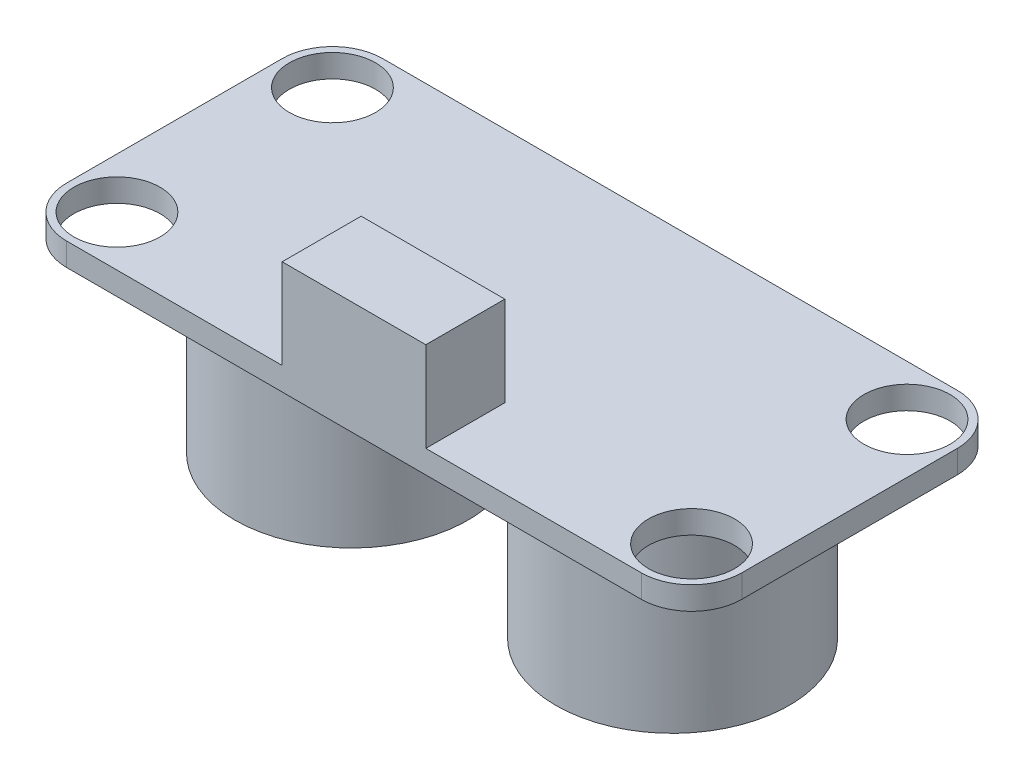
ISO-10303-21;
HEADER;
FILE_DESCRIPTION(('STEP AP214'),'2;1');
FILE_NAME('part.step','',(''),(''),'','','');
FILE_SCHEMA(('AUTOMOTIVE_DESIGN { 1 0 10303 214 1 1 1 1 }'));
ENDSEC;
DATA;
#1=APPLICATION_CONTEXT('core data for automotive mechanical design processes');
#2=APPLICATION_PROTOCOL_DEFINITION('international standard','automotive_design',2000,#1);
#3=PRODUCT_CONTEXT('',#1,'mechanical');
#4=PRODUCT('Part','Part','',(#3));
#5=PRODUCT_RELATED_PRODUCT_CATEGORY('part','',(#4));
#6=PRODUCT_DEFINITION_FORMATION('','',#4);
#7=PRODUCT_DEFINITION_CONTEXT('part definition',#1,'design');
#8=PRODUCT_DEFINITION('design','',#6,#7);
#9=PRODUCT_DEFINITION_SHAPE('','',#8);
#10=(LENGTH_UNIT() NAMED_UNIT(*) SI_UNIT(.MILLI.,.METRE.));
#11=(NAMED_UNIT(*) PLANE_ANGLE_UNIT() SI_UNIT($,.RADIAN.));
#12=(NAMED_UNIT(*) SI_UNIT($,.STERADIAN.) SOLID_ANGLE_UNIT());
#13=UNCERTAINTY_MEASURE_WITH_UNIT(LENGTH_MEASURE(1.E-05),#10,'distance_accuracy_value','');
#14=(GEOMETRIC_REPRESENTATION_CONTEXT(3) GLOBAL_UNCERTAINTY_ASSIGNED_CONTEXT((#13)) GLOBAL_UNIT_ASSIGNED_CONTEXT((#10,
#11,#12)) REPRESENTATION_CONTEXT('',''));
#15=CARTESIAN_POINT('',(0.,0.,0.));
#16=DIRECTION('',(0.,0.,1.));
#17=DIRECTION('',(1.,0.,0.));
#18=AXIS2_PLACEMENT_3D('',#15,#16,#17);
#19=CARTESIAN_POINT('',(43.5,1.6,-18.5));
#20=DIRECTION('',(0.,1.,0.));
#21=DIRECTION('',(0.,0.,1.));
#22=AXIS2_PLACEMENT_3D('',#19,#20,#21);
#23=PLANE('',#22);
#24=DIRECTION('',(0.,0.,1.));
#25=VECTOR('',#24,1.);
#26=CARTESIAN_POINT('',(18.5,1.6,-5.5));
#27=LINE('',#26,#25);
#28=CARTESIAN_POINT('',(18.5,1.6,-5.5));
#29=VERTEX_POINT('',#28);
#30=CARTESIAN_POINT('',(18.5,1.6,0.));
#31=VERTEX_POINT('',#30);
#32=EDGE_CURVE('E61',#29,#31,#27,.T.);
#33=ORIENTED_EDGE('',*,*,#32,.F.);
#34=DIRECTION('',(-1.,0.,0.));
#35=VECTOR('',#34,1.);
#36=CARTESIAN_POINT('',(28.5,1.6,-5.5));
#37=LINE('',#36,#35);
#38=CARTESIAN_POINT('',(28.5,1.6,-5.5));
#39=VERTEX_POINT('',#38);
#40=EDGE_CURVE('E156',#39,#29,#37,.T.);
#41=ORIENTED_EDGE('',*,*,#40,.F.);
#42=DIRECTION('',(0.,0.,-1.));
#43=VECTOR('',#42,1.);
#44=CARTESIAN_POINT('',(28.5,1.6,0.));
#45=LINE('',#44,#43);
#46=CARTESIAN_POINT('',(28.5,1.6,0.));
#47=VERTEX_POINT('',#46);
#48=EDGE_CURVE('E67',#47,#39,#45,.T.);
#49=ORIENTED_EDGE('',*,*,#48,.F.);
#50=DIRECTION('',(1.,0.,0.));
#51=VECTOR('',#50,1.);
#52=CARTESIAN_POINT('',(3.50000000000002,1.6,0.));
#53=LINE('',#52,#51);
#54=CARTESIAN_POINT('',(43.5,1.6,0.));
#55=VERTEX_POINT('',#54);
#56=EDGE_CURVE('E216',#47,#55,#53,.T.);
#57=ORIENTED_EDGE('',*,*,#56,.T.);
#58=CARTESIAN_POINT('',(43.5,1.6,-3.5));
#59=DIRECTION('',(0.,1.,0.));
#60=DIRECTION('',(0.,0.,1.));
#61=AXIS2_PLACEMENT_3D('',#58,#59,#60);
#62=CIRCLE('',#61,3.5);
#63=CARTESIAN_POINT('',(47.,1.6,-3.5));
#64=VERTEX_POINT('',#63);
#65=EDGE_CURVE('E220',#55,#64,#62,.T.);
#66=ORIENTED_EDGE('',*,*,#65,.T.);
#67=DIRECTION('',(0.,0.,-1.));
#68=VECTOR('',#67,1.);
#69=CARTESIAN_POINT('',(47.,1.6,-3.5));
#70=LINE('',#69,#68);
#71=CARTESIAN_POINT('',(47.,1.6,-18.5));
#72=VERTEX_POINT('',#71);
#73=EDGE_CURVE('E223',#64,#72,#70,.T.);
#74=ORIENTED_EDGE('',*,*,#73,.T.);
#75=CARTESIAN_POINT('',(43.5,1.6,-18.5));
#76=DIRECTION('',(0.,1.,0.));
#77=DIRECTION('',(0.,0.,1.));
#78=AXIS2_PLACEMENT_3D('',#75,#76,#77);
#79=CIRCLE('',#78,3.5);
#80=CARTESIAN_POINT('',(43.5,1.6,-22.));
#81=VERTEX_POINT('',#80);
#82=EDGE_CURVE('E199',#72,#81,#79,.T.);
#83=ORIENTED_EDGE('',*,*,#82,.T.);
#84=DIRECTION('',(-1.,0.,0.));
#85=VECTOR('',#84,1.);
#86=CARTESIAN_POINT('',(43.5,1.6,-22.));
#87=LINE('',#86,#85);
#88=CARTESIAN_POINT('',(3.5,1.6,-22.));
#89=VERTEX_POINT('',#88);
#90=EDGE_CURVE('E203',#81,#89,#87,.T.);
#91=ORIENTED_EDGE('',*,*,#90,.T.);
#92=CARTESIAN_POINT('',(3.5,1.6,-18.5));
#93=DIRECTION('',(0.,1.,0.));
#94=DIRECTION('',(0.,0.,1.));
#95=AXIS2_PLACEMENT_3D('',#92,#93,#94);
#96=CIRCLE('',#95,3.5);
#97=CARTESIAN_POINT('',(0.,1.6,-18.5));
#98=VERTEX_POINT('',#97);
#99=EDGE_CURVE('E207',#89,#98,#96,.T.);
#100=ORIENTED_EDGE('',*,*,#99,.T.);
#101=DIRECTION('',(0.,0.,1.));
#102=VECTOR('',#101,1.);
#103=CARTESIAN_POINT('',(0.,1.6,-18.5));
#104=LINE('',#103,#102);
#105=CARTESIAN_POINT('',(0.,1.6,-3.50000000000002));
#106=VERTEX_POINT('',#105);
#107=EDGE_CURVE('E210',#98,#106,#104,.T.);
#108=ORIENTED_EDGE('',*,*,#107,.T.);
#109=CARTESIAN_POINT('',(3.5,1.6,-3.5));
#110=DIRECTION('',(0.,1.,0.));
#111=DIRECTION('',(0.,0.,-1.));
#112=AXIS2_PLACEMENT_3D('',#109,#110,#111);
#113=CIRCLE('',#112,3.5);
#114=CARTESIAN_POINT('',(3.50000000000002,1.6,0.));
#115=VERTEX_POINT('',#114);
#116=EDGE_CURVE('E213',#106,#115,#113,.T.);
#117=ORIENTED_EDGE('',*,*,#116,.T.);
#118=EDGE_CURVE('E217',#115,#31,#53,.T.);
#119=ORIENTED_EDGE('',*,*,#118,.T.);
#120=EDGE_LOOP('',(#33,#41,#49,#57,#66,#74,#83,#91,#100,#108,#117,#119));
#121=FACE_BOUND('',#120,.T.);
#122=CARTESIAN_POINT('',(43.5,1.6,-3.5));
#123=DIRECTION('',(0.,1.,0.));
#124=DIRECTION('',(0.,0.,1.));
#125=AXIS2_PLACEMENT_3D('',#122,#123,#124);
#126=CIRCLE('',#125,3.00000000000001);
#127=CARTESIAN_POINT('',(43.5,1.6,-0.499999999999992));
#128=VERTEX_POINT('',#127);
#129=EDGE_CURVE('E175',#128,#128,#126,.T.);
#130=ORIENTED_EDGE('',*,*,#129,.F.);
#131=EDGE_LOOP('',(#130));
#132=FACE_BOUND('',#131,.T.);
#133=CARTESIAN_POINT('',(3.5,1.6,-18.5));
#134=DIRECTION('',(0.,1.,0.));
#135=DIRECTION('',(0.,0.,1.));
#136=AXIS2_PLACEMENT_3D('',#133,#134,#135);
#137=CIRCLE('',#136,3.);
#138=CARTESIAN_POINT('',(3.5,1.6,-15.5));
#139=VERTEX_POINT('',#138);
#140=EDGE_CURVE('E191',#139,#139,#137,.T.);
#141=ORIENTED_EDGE('',*,*,#140,.F.);
#142=EDGE_LOOP('',(#141));
#143=FACE_BOUND('',#142,.T.);
#144=CARTESIAN_POINT('',(3.5,1.6,-3.5));
#145=DIRECTION('',(0.,1.,0.));
#146=DIRECTION('',(0.,0.,1.));
#147=AXIS2_PLACEMENT_3D('',#144,#145,#146);
#148=CIRCLE('',#147,3.);
#149=CARTESIAN_POINT('',(3.5,1.6,-0.5));
#150=VERTEX_POINT('',#149);
#151=EDGE_CURVE('E183',#150,#150,#148,.T.);
#152=ORIENTED_EDGE('',*,*,#151,.F.);
#153=EDGE_LOOP('',(#152));
#154=FACE_BOUND('',#153,.T.);
#155=CARTESIAN_POINT('',(43.5,1.6,-18.5));
#156=DIRECTION('',(0.,1.,0.));
#157=DIRECTION('',(0.,0.,1.));
#158=AXIS2_PLACEMENT_3D('',#155,#156,#157);
#159=CIRCLE('',#158,3.00000000000001);
#160=CARTESIAN_POINT('',(43.5,1.6,-15.5));
#161=VERTEX_POINT('',#160);
#162=EDGE_CURVE('E165',#161,#161,#159,.T.);
#163=ORIENTED_EDGE('',*,*,#162,.F.);
#164=EDGE_LOOP('',(#163));
#165=FACE_BOUND('',#164,.T.);
#166=ADVANCED_FACE('F45',(#121,#132,#143,#154,#165),#23,.T.);
#167=CARTESIAN_POINT('',(43.5,0.,-18.5));
#168=DIRECTION('',(0.,1.,0.));
#169=DIRECTION('',(0.,0.,1.));
#170=AXIS2_PLACEMENT_3D('',#167,#168,#169);
#171=PLANE('',#170);
#172=CARTESIAN_POINT('',(34.675,0.,-11.));
#173=DIRECTION('',(0.,1.,0.));
#174=DIRECTION('',(0.,0.,1.));
#175=AXIS2_PLACEMENT_3D('',#172,#173,#174);
#176=CIRCLE('',#175,8.125);
#177=CARTESIAN_POINT('',(34.675,0.,-2.875));
#178=VERTEX_POINT('',#177);
#179=EDGE_CURVE('E11',#178,#178,#176,.F.);
#180=ORIENTED_EDGE('',*,*,#179,.F.);
#181=EDGE_LOOP('',(#180));
#182=FACE_BOUND('',#181,.T.);
#183=CARTESIAN_POINT('',(12.325,0.,-11.));
#184=DIRECTION('',(0.,1.,0.));
#185=DIRECTION('',(0.,0.,1.));
#186=AXIS2_PLACEMENT_3D('',#183,#184,#185);
#187=CIRCLE('',#186,8.125);
#188=CARTESIAN_POINT('',(12.325,0.,-2.875));
#189=VERTEX_POINT('',#188);
#190=EDGE_CURVE('E54',#189,#189,#187,.F.);
#191=ORIENTED_EDGE('',*,*,#190,.F.);
#192=EDGE_LOOP('',(#191));
#193=FACE_BOUND('',#192,.T.);
#194=CARTESIAN_POINT('',(43.5,0.,-18.5));
#195=DIRECTION('',(0.,1.,0.));
#196=DIRECTION('',(0.,0.,1.));
#197=AXIS2_PLACEMENT_3D('',#194,#195,#196);
#198=CIRCLE('',#197,3.5);
#199=CARTESIAN_POINT('',(47.,0.,-18.5));
#200=VERTEX_POINT('',#199);
#201=CARTESIAN_POINT('',(43.5,0.,-22.));
#202=VERTEX_POINT('',#201);
#203=EDGE_CURVE('E195',#200,#202,#198,.T.);
#204=ORIENTED_EDGE('',*,*,#203,.F.);
#205=DIRECTION('',(0.,0.,-1.));
#206=VECTOR('',#205,1.);
#207=CARTESIAN_POINT('',(47.,0.,-3.5));
#208=LINE('',#207,#206);
#209=CARTESIAN_POINT('',(47.,0.,-3.5));
#210=VERTEX_POINT('',#209);
#211=EDGE_CURVE('E204',#210,#200,#208,.T.);
#212=ORIENTED_EDGE('',*,*,#211,.F.);
#213=CARTESIAN_POINT('',(43.5,0.,-3.5));
#214=DIRECTION('',(0.,1.,0.));
#215=DIRECTION('',(0.,0.,1.));
#216=AXIS2_PLACEMENT_3D('',#213,#214,#215);
#217=CIRCLE('',#216,3.5);
#218=CARTESIAN_POINT('',(43.5,0.,0.));
#219=VERTEX_POINT('',#218);
#220=EDGE_CURVE('E245',#219,#210,#217,.T.);
#221=ORIENTED_EDGE('',*,*,#220,.F.);
#222=DIRECTION('',(1.,0.,0.));
#223=VECTOR('',#222,1.);
#224=CARTESIAN_POINT('',(3.50000000000002,0.,0.));
#225=LINE('',#224,#223);
#226=CARTESIAN_POINT('',(3.50000000000002,0.,0.));
#227=VERTEX_POINT('',#226);
#228=EDGE_CURVE('E242',#227,#219,#225,.T.);
#229=ORIENTED_EDGE('',*,*,#228,.F.);
#230=CARTESIAN_POINT('',(3.5,0.,-3.5));
#231=DIRECTION('',(0.,1.,0.));
#232=DIRECTION('',(0.,0.,-1.));
#233=AXIS2_PLACEMENT_3D('',#230,#231,#232);
#234=CIRCLE('',#233,3.5);
#235=CARTESIAN_POINT('',(0.,0.,-3.50000000000002));
#236=VERTEX_POINT('',#235);
#237=EDGE_CURVE('E239',#236,#227,#234,.T.);
#238=ORIENTED_EDGE('',*,*,#237,.F.);
#239=DIRECTION('',(0.,0.,1.));
#240=VECTOR('',#239,1.);
#241=CARTESIAN_POINT('',(0.,0.,-18.5));
#242=LINE('',#241,#240);
#243=CARTESIAN_POINT('',(0.,0.,-18.5));
#244=VERTEX_POINT('',#243);
#245=EDGE_CURVE('E236',#244,#236,#242,.T.);
#246=ORIENTED_EDGE('',*,*,#245,.F.);
#247=CARTESIAN_POINT('',(3.5,0.,-18.5));
#248=DIRECTION('',(0.,1.,0.));
#249=DIRECTION('',(0.,0.,1.));
#250=AXIS2_PLACEMENT_3D('',#247,#248,#249);
#251=CIRCLE('',#250,3.5);
#252=CARTESIAN_POINT('',(3.5,0.,-22.));
#253=VERTEX_POINT('',#252);
#254=EDGE_CURVE('E233',#253,#244,#251,.T.);
#255=ORIENTED_EDGE('',*,*,#254,.F.);
#256=DIRECTION('',(-1.,0.,0.));
#257=VECTOR('',#256,1.);
#258=CARTESIAN_POINT('',(43.5,0.,-22.));
#259=LINE('',#258,#257);
#260=EDGE_CURVE('E230',#202,#253,#259,.T.);
#261=ORIENTED_EDGE('',*,*,#260,.F.);
#262=EDGE_LOOP('',(#204,#212,#221,#229,#238,#246,#255,#261));
#263=FACE_BOUND('',#262,.T.);
#264=CARTESIAN_POINT('',(3.5,0.,-18.5));
#265=DIRECTION('',(0.,1.,0.));
#266=DIRECTION('',(0.,0.,1.));
#267=AXIS2_PLACEMENT_3D('',#264,#265,#266);
#268=CIRCLE('',#267,3.);
#269=CARTESIAN_POINT('',(3.5,0.,-15.5));
#270=VERTEX_POINT('',#269);
#271=EDGE_CURVE('E187',#270,#270,#268,.T.);
#272=ORIENTED_EDGE('',*,*,#271,.T.);
#273=EDGE_LOOP('',(#272));
#274=FACE_BOUND('',#273,.T.);
#275=CARTESIAN_POINT('',(3.5,0.,-3.5));
#276=DIRECTION('',(0.,1.,0.));
#277=DIRECTION('',(0.,0.,1.));
#278=AXIS2_PLACEMENT_3D('',#275,#276,#277);
#279=CIRCLE('',#278,3.);
#280=CARTESIAN_POINT('',(3.5,0.,-0.5));
#281=VERTEX_POINT('',#280);
#282=EDGE_CURVE('E179',#281,#281,#279,.T.);
#283=ORIENTED_EDGE('',*,*,#282,.T.);
#284=EDGE_LOOP('',(#283));
#285=FACE_BOUND('',#284,.T.);
#286=CARTESIAN_POINT('',(43.5,0.,-3.5));
#287=DIRECTION('',(0.,1.,0.));
#288=DIRECTION('',(0.,0.,1.));
#289=AXIS2_PLACEMENT_3D('',#286,#287,#288);
#290=CIRCLE('',#289,3.00000000000001);
#291=CARTESIAN_POINT('',(43.5,0.,-0.499999999999992));
#292=VERTEX_POINT('',#291);
#293=EDGE_CURVE('E173',#292,#292,#290,.T.);
#294=ORIENTED_EDGE('',*,*,#293,.T.);
#295=EDGE_LOOP('',(#294));
#296=FACE_BOUND('',#295,.T.);
#297=CARTESIAN_POINT('',(43.5,0.,-18.5));
#298=DIRECTION('',(0.,1.,0.));
#299=DIRECTION('',(0.,0.,1.));
#300=AXIS2_PLACEMENT_3D('',#297,#298,#299);
#301=CIRCLE('',#300,3.00000000000001);
#302=CARTESIAN_POINT('',(43.5,0.,-15.5));
#303=VERTEX_POINT('',#302);
#304=EDGE_CURVE('E160',#303,#303,#301,.T.);
#305=ORIENTED_EDGE('',*,*,#304,.T.);
#306=EDGE_LOOP('',(#305));
#307=FACE_BOUND('',#306,.T.);
#308=ADVANCED_FACE('F286',(#182,#193,#263,#274,#285,#296,#307),#171,.F.);
#309=CARTESIAN_POINT('',(43.5,1.6,-18.5));
#310=DIRECTION('',(0.,-1.,0.));
#311=DIRECTION('',(0.,0.,-1.));
#312=AXIS2_PLACEMENT_3D('',#309,#310,#311);
#313=CYLINDRICAL_SURFACE('',#312,3.5);
#314=ORIENTED_EDGE('',*,*,#203,.T.);
#315=DIRECTION('',(0.,-1.,0.));
#316=VECTOR('',#315,1.);
#317=CARTESIAN_POINT('',(43.5,1.6,-22.));
#318=LINE('',#317,#316);
#319=EDGE_CURVE('E277',#81,#202,#318,.T.);
#320=ORIENTED_EDGE('',*,*,#319,.F.);
#321=ORIENTED_EDGE('',*,*,#82,.F.);
#322=DIRECTION('',(0.,-1.,0.));
#323=VECTOR('',#322,1.);
#324=CARTESIAN_POINT('',(47.,1.6,-18.5));
#325=LINE('',#324,#323);
#326=EDGE_CURVE('E226',#72,#200,#325,.T.);
#327=ORIENTED_EDGE('',*,*,#326,.T.);
#328=EDGE_LOOP('',(#314,#320,#321,#327));
#329=FACE_BOUND('',#328,.T.);
#330=ADVANCED_FACE('F47',(#329),#313,.T.);
#331=CARTESIAN_POINT('',(43.5,1.6,-22.));
#332=DIRECTION('',(0.,0.,1.));
#333=DIRECTION('',(1.,0.,0.));
#334=AXIS2_PLACEMENT_3D('',#331,#332,#333);
#335=PLANE('',#334);
#336=ORIENTED_EDGE('',*,*,#260,.T.);
#337=DIRECTION('',(0.,-1.,0.));
#338=VECTOR('',#337,1.);
#339=CARTESIAN_POINT('',(3.5,1.6,-22.));
#340=LINE('',#339,#338);
#341=EDGE_CURVE('E273',#89,#253,#340,.T.);
#342=ORIENTED_EDGE('',*,*,#341,.F.);
#343=ORIENTED_EDGE('',*,*,#90,.F.);
#344=ORIENTED_EDGE('',*,*,#319,.T.);
#345=EDGE_LOOP('',(#336,#342,#343,#344));
#346=FACE_BOUND('',#345,.T.);
#347=ADVANCED_FACE('F345',(#346),#335,.F.);
#348=CARTESIAN_POINT('',(3.5,1.6,-18.5));
#349=DIRECTION('',(0.,-1.,0.));
#350=DIRECTION('',(0.,0.,-1.));
#351=AXIS2_PLACEMENT_3D('',#348,#349,#350);
#352=CYLINDRICAL_SURFACE('',#351,3.5);
#353=ORIENTED_EDGE('',*,*,#254,.T.);
#354=DIRECTION('',(0.,-1.,0.));
#355=VECTOR('',#354,1.);
#356=CARTESIAN_POINT('',(0.,1.6,-18.5));
#357=LINE('',#356,#355);
#358=EDGE_CURVE('E269',#98,#244,#357,.T.);
#359=ORIENTED_EDGE('',*,*,#358,.F.);
#360=ORIENTED_EDGE('',*,*,#99,.F.);
#361=ORIENTED_EDGE('',*,*,#341,.T.);
#362=EDGE_LOOP('',(#353,#359,#360,#361));
#363=FACE_BOUND('',#362,.T.);
#364=ADVANCED_FACE('F342',(#363),#352,.T.);
#365=CARTESIAN_POINT('',(0.,1.6,-18.5));
#366=DIRECTION('',(1.,0.,0.));
#367=DIRECTION('',(0.,0.,-1.));
#368=AXIS2_PLACEMENT_3D('',#365,#366,#367);
#369=PLANE('',#368);
#370=ORIENTED_EDGE('',*,*,#245,.T.);
#371=DIRECTION('',(0.,-1.,0.));
#372=VECTOR('',#371,1.);
#373=CARTESIAN_POINT('',(0.,1.6,-3.50000000000002));
#374=LINE('',#373,#372);
#375=EDGE_CURVE('E265',#106,#236,#374,.T.);
#376=ORIENTED_EDGE('',*,*,#375,.F.);
#377=ORIENTED_EDGE('',*,*,#107,.F.);
#378=ORIENTED_EDGE('',*,*,#358,.T.);
#379=EDGE_LOOP('',(#370,#376,#377,#378));
#380=FACE_BOUND('',#379,.T.);
#381=ADVANCED_FACE('F338',(#380),#369,.F.);
#382=CARTESIAN_POINT('',(3.5,1.6,-3.5));
#383=DIRECTION('',(0.,-1.,0.));
#384=DIRECTION('',(0.,0.,-1.));
#385=AXIS2_PLACEMENT_3D('',#382,#383,#384);
#386=CYLINDRICAL_SURFACE('',#385,3.5);
#387=ORIENTED_EDGE('',*,*,#237,.T.);
#388=DIRECTION('',(0.,-1.,0.));
#389=VECTOR('',#388,1.);
#390=CARTESIAN_POINT('',(3.50000000000002,1.6,0.));
#391=LINE('',#390,#389);
#392=EDGE_CURVE('E261',#115,#227,#391,.T.);
#393=ORIENTED_EDGE('',*,*,#392,.F.);
#394=ORIENTED_EDGE('',*,*,#116,.F.);
#395=ORIENTED_EDGE('',*,*,#375,.T.);
#396=EDGE_LOOP('',(#387,#393,#394,#395));
#397=FACE_BOUND('',#396,.T.);
#398=ADVANCED_FACE('F335',(#397),#386,.T.);
#399=CARTESIAN_POINT('',(3.50000000000002,1.6,0.));
#400=DIRECTION('',(0.,0.,-1.));
#401=DIRECTION('',(-1.,0.,0.));
#402=AXIS2_PLACEMENT_3D('',#399,#400,#401);
#403=PLANE('',#402);
#404=ORIENTED_EDGE('',*,*,#228,.T.);
#405=DIRECTION('',(0.,-1.,0.));
#406=VECTOR('',#405,1.);
#407=CARTESIAN_POINT('',(43.5,1.6,0.));
#408=LINE('',#407,#406);
#409=EDGE_CURVE('E257',#55,#219,#408,.T.);
#410=ORIENTED_EDGE('',*,*,#409,.F.);
#411=ORIENTED_EDGE('',*,*,#56,.F.);
#412=DIRECTION('',(0.,-1.,0.));
#413=VECTOR('',#412,1.);
#414=CARTESIAN_POINT('',(28.5,7.85,0.));
#415=LINE('',#414,#413);
#416=CARTESIAN_POINT('',(28.5,7.85,0.));
#417=VERTEX_POINT('',#416);
#418=EDGE_CURVE('E141',#417,#47,#415,.T.);
#419=ORIENTED_EDGE('',*,*,#418,.F.);
#420=DIRECTION('',(1.,0.,0.));
#421=VECTOR('',#420,1.);
#422=CARTESIAN_POINT('',(18.5,7.85,0.));
#423=LINE('',#422,#421);
#424=CARTESIAN_POINT('',(18.5,7.85,0.));
#425=VERTEX_POINT('',#424);
#426=EDGE_CURVE('E134',#425,#417,#423,.T.);
#427=ORIENTED_EDGE('',*,*,#426,.F.);
#428=DIRECTION('',(0.,-1.,0.));
#429=VECTOR('',#428,1.);
#430=CARTESIAN_POINT('',(18.5,7.85,0.));
#431=LINE('',#430,#429);
#432=EDGE_CURVE('E139',#425,#31,#431,.T.);
#433=ORIENTED_EDGE('',*,*,#432,.T.);
#434=ORIENTED_EDGE('',*,*,#118,.F.);
#435=ORIENTED_EDGE('',*,*,#392,.T.);
#436=EDGE_LOOP('',(#404,#410,#411,#419,#427,#433,#434,#435));
#437=FACE_BOUND('',#436,.T.);
#438=ADVANCED_FACE('F136',(#437),#403,.F.);
#439=CARTESIAN_POINT('',(43.5,1.6,-3.5));
#440=DIRECTION('',(0.,-1.,0.));
#441=DIRECTION('',(0.,0.,-1.));
#442=AXIS2_PLACEMENT_3D('',#439,#440,#441);
#443=CYLINDRICAL_SURFACE('',#442,3.5);
#444=ORIENTED_EDGE('',*,*,#220,.T.);
#445=DIRECTION('',(0.,-1.,0.));
#446=VECTOR('',#445,1.);
#447=CARTESIAN_POINT('',(47.,1.6,-3.5));
#448=LINE('',#447,#446);
#449=EDGE_CURVE('E253',#64,#210,#448,.T.);
#450=ORIENTED_EDGE('',*,*,#449,.F.);
#451=ORIENTED_EDGE('',*,*,#65,.F.);
#452=ORIENTED_EDGE('',*,*,#409,.T.);
#453=EDGE_LOOP('',(#444,#450,#451,#452));
#454=FACE_BOUND('',#453,.T.);
#455=ADVANCED_FACE('F328',(#454),#443,.T.);
#456=CARTESIAN_POINT('',(47.,1.6,-3.5));
#457=DIRECTION('',(-1.,0.,0.));
#458=DIRECTION('',(0.,0.,1.));
#459=AXIS2_PLACEMENT_3D('',#456,#457,#458);
#460=PLANE('',#459);
#461=ORIENTED_EDGE('',*,*,#211,.T.);
#462=ORIENTED_EDGE('',*,*,#326,.F.);
#463=ORIENTED_EDGE('',*,*,#73,.F.);
#464=ORIENTED_EDGE('',*,*,#449,.T.);
#465=EDGE_LOOP('',(#461,#462,#463,#464));
#466=FACE_BOUND('',#465,.T.);
#467=ADVANCED_FACE('F325',(#466),#460,.F.);
#468=CARTESIAN_POINT('',(3.5,1.6,-18.5));
#469=DIRECTION('',(0.,-1.,0.));
#470=DIRECTION('',(0.,0.,-1.));
#471=AXIS2_PLACEMENT_3D('',#468,#469,#470);
#472=CYLINDRICAL_SURFACE('',#471,3.);
#473=ORIENTED_EDGE('',*,*,#140,.T.);
#474=EDGE_LOOP('',(#473));
#475=FACE_BOUND('',#474,.T.);
#476=ORIENTED_EDGE('',*,*,#271,.F.);
#477=EDGE_LOOP('',(#476));
#478=FACE_BOUND('',#477,.T.);
#479=ADVANCED_FACE('F322',(#475,#478),#472,.F.);
#480=CARTESIAN_POINT('',(3.5,1.6,-3.5));
#481=DIRECTION('',(0.,-1.,0.));
#482=DIRECTION('',(0.,0.,-1.));
#483=AXIS2_PLACEMENT_3D('',#480,#481,#482);
#484=CYLINDRICAL_SURFACE('',#483,3.);
#485=ORIENTED_EDGE('',*,*,#151,.T.);
#486=EDGE_LOOP('',(#485));
#487=FACE_BOUND('',#486,.T.);
#488=ORIENTED_EDGE('',*,*,#282,.F.);
#489=EDGE_LOOP('',(#488));
#490=FACE_BOUND('',#489,.T.);
#491=ADVANCED_FACE('F313',(#487,#490),#484,.F.);
#492=CARTESIAN_POINT('',(43.5,1.6,-3.5));
#493=DIRECTION('',(0.,-1.,0.));
#494=DIRECTION('',(0.,0.,-1.));
#495=AXIS2_PLACEMENT_3D('',#492,#493,#494);
#496=CYLINDRICAL_SURFACE('',#495,3.00000000000001);
#497=ORIENTED_EDGE('',*,*,#129,.T.);
#498=EDGE_LOOP('',(#497));
#499=FACE_BOUND('',#498,.T.);
#500=ORIENTED_EDGE('',*,*,#293,.F.);
#501=EDGE_LOOP('',(#500));
#502=FACE_BOUND('',#501,.T.);
#503=ADVANCED_FACE('F304',(#499,#502),#496,.F.);
#504=CARTESIAN_POINT('',(43.5,1.6,-18.5));
#505=DIRECTION('',(0.,-1.,0.));
#506=DIRECTION('',(0.,0.,-1.));
#507=AXIS2_PLACEMENT_3D('',#504,#505,#506);
#508=CYLINDRICAL_SURFACE('',#507,3.00000000000001);
#509=ORIENTED_EDGE('',*,*,#162,.T.);
#510=EDGE_LOOP('',(#509));
#511=FACE_BOUND('',#510,.T.);
#512=ORIENTED_EDGE('',*,*,#304,.F.);
#513=EDGE_LOOP('',(#512));
#514=FACE_BOUND('',#513,.T.);
#515=ADVANCED_FACE('F302',(#511,#514),#508,.F.);
#516=CARTESIAN_POINT('',(18.5,7.85,-5.5));
#517=DIRECTION('',(1.,0.,0.));
#518=DIRECTION('',(0.,0.,-1.));
#519=AXIS2_PLACEMENT_3D('',#516,#517,#518);
#520=PLANE('',#519);
#521=ORIENTED_EDGE('',*,*,#32,.T.);
#522=ORIENTED_EDGE('',*,*,#432,.F.);
#523=DIRECTION('',(0.,0.,1.));
#524=VECTOR('',#523,1.);
#525=CARTESIAN_POINT('',(18.5,7.85,-5.5));
#526=LINE('',#525,#524);
#527=CARTESIAN_POINT('',(18.5,7.85,-5.5));
#528=VERTEX_POINT('',#527);
#529=EDGE_CURVE('E146',#528,#425,#526,.T.);
#530=ORIENTED_EDGE('',*,*,#529,.F.);
#531=DIRECTION('',(0.,-1.,0.));
#532=VECTOR('',#531,1.);
#533=CARTESIAN_POINT('',(18.5,7.85,-5.5));
#534=LINE('',#533,#532);
#535=EDGE_CURVE('E379',#528,#29,#534,.T.);
#536=ORIENTED_EDGE('',*,*,#535,.T.);
#537=EDGE_LOOP('',(#521,#522,#530,#536));
#538=FACE_BOUND('',#537,.T.);
#539=ADVANCED_FACE('F158',(#538),#520,.F.);
#540=CARTESIAN_POINT('',(28.5,7.85,0.));
#541=DIRECTION('',(-1.,0.,0.));
#542=DIRECTION('',(0.,0.,1.));
#543=AXIS2_PLACEMENT_3D('',#540,#541,#542);
#544=PLANE('',#543);
#545=ORIENTED_EDGE('',*,*,#48,.T.);
#546=DIRECTION('',(0.,-1.,0.));
#547=VECTOR('',#546,1.);
#548=CARTESIAN_POINT('',(28.5,7.85,-5.5));
#549=LINE('',#548,#547);
#550=CARTESIAN_POINT('',(28.5,7.85,-5.5));
#551=VERTEX_POINT('',#550);
#552=EDGE_CURVE('E167',#551,#39,#549,.T.);
#553=ORIENTED_EDGE('',*,*,#552,.F.);
#554=DIRECTION('',(0.,0.,-1.));
#555=VECTOR('',#554,1.);
#556=CARTESIAN_POINT('',(28.5,7.85,0.));
#557=LINE('',#556,#555);
#558=EDGE_CURVE('E145',#417,#551,#557,.T.);
#559=ORIENTED_EDGE('',*,*,#558,.F.);
#560=ORIENTED_EDGE('',*,*,#418,.T.);
#561=EDGE_LOOP('',(#545,#553,#559,#560));
#562=FACE_BOUND('',#561,.T.);
#563=ADVANCED_FACE('F311',(#562),#544,.F.);
#564=CARTESIAN_POINT('',(28.5,7.85,-5.5));
#565=DIRECTION('',(0.,0.,1.));
#566=DIRECTION('',(1.,0.,0.));
#567=AXIS2_PLACEMENT_3D('',#564,#565,#566);
#568=PLANE('',#567);
#569=ORIENTED_EDGE('',*,*,#40,.T.);
#570=ORIENTED_EDGE('',*,*,#535,.F.);
#571=DIRECTION('',(-1.,0.,0.));
#572=VECTOR('',#571,1.);
#573=CARTESIAN_POINT('',(28.5,7.85,-5.5));
#574=LINE('',#573,#572);
#575=EDGE_CURVE('E151',#551,#528,#574,.T.);
#576=ORIENTED_EDGE('',*,*,#575,.F.);
#577=ORIENTED_EDGE('',*,*,#552,.T.);
#578=EDGE_LOOP('',(#569,#570,#576,#577));
#579=FACE_BOUND('',#578,.T.);
#580=ADVANCED_FACE('F392',(#579),#568,.F.);
#581=CARTESIAN_POINT('',(0.,7.85,0.));
#582=DIRECTION('',(0.,1.,0.));
#583=DIRECTION('',(0.,0.,1.));
#584=AXIS2_PLACEMENT_3D('',#581,#582,#583);
#585=PLANE('',#584);
#586=ORIENTED_EDGE('',*,*,#529,.T.);
#587=ORIENTED_EDGE('',*,*,#426,.T.);
#588=ORIENTED_EDGE('',*,*,#558,.T.);
#589=ORIENTED_EDGE('',*,*,#575,.T.);
#590=EDGE_LOOP('',(#586,#587,#588,#589));
#591=FACE_BOUND('',#590,.T.);
#592=ADVANCED_FACE('F149',(#591),#585,.T.);
#593=CARTESIAN_POINT('',(12.325,-12.25,-11.));
#594=DIRECTION('',(0.,1.,0.));
#595=DIRECTION('',(0.,0.,1.));
#596=AXIS2_PLACEMENT_3D('',#593,#594,#595);
#597=CYLINDRICAL_SURFACE('',#596,8.125);
#598=CARTESIAN_POINT('',(12.325,-12.25,-11.));
#599=DIRECTION('',(0.,-1.,0.));
#600=DIRECTION('',(0.,0.,-1.));
#601=AXIS2_PLACEMENT_3D('',#598,#599,#600);
#602=CIRCLE('',#601,8.125);
#603=CARTESIAN_POINT('',(12.325,-12.25,-19.125));
#604=VERTEX_POINT('',#603);
#605=EDGE_CURVE('E384',#604,#604,#602,.T.);
#606=ORIENTED_EDGE('',*,*,#605,.F.);
#607=EDGE_LOOP('',(#606));
#608=FACE_BOUND('',#607,.T.);
#609=ORIENTED_EDGE('',*,*,#190,.T.);
#610=EDGE_LOOP('',(#609));
#611=FACE_BOUND('',#610,.T.);
#612=ADVANCED_FACE('F284',(#608,#611),#597,.T.);
#613=CARTESIAN_POINT('',(12.325,-12.25,-11.));
#614=DIRECTION('',(0.,-1.,0.));
#615=DIRECTION('',(0.,0.,-1.));
#616=AXIS2_PLACEMENT_3D('',#613,#614,#615);
#617=PLANE('',#616);
#618=ORIENTED_EDGE('',*,*,#605,.T.);
#619=EDGE_LOOP('',(#618));
#620=FACE_BOUND('',#619,.T.);
#621=ADVANCED_FACE('F404',(#620),#617,.T.);
#622=CARTESIAN_POINT('',(34.675,-12.25,-11.));
#623=DIRECTION('',(0.,1.,0.));
#624=DIRECTION('',(0.,0.,1.));
#625=AXIS2_PLACEMENT_3D('',#622,#623,#624);
#626=CYLINDRICAL_SURFACE('',#625,8.125);
#627=CARTESIAN_POINT('',(34.675,-12.25,-11.));
#628=DIRECTION('',(0.,-1.,0.));
#629=DIRECTION('',(0.,0.,-1.));
#630=AXIS2_PLACEMENT_3D('',#627,#628,#629);
#631=CIRCLE('',#630,8.125);
#632=CARTESIAN_POINT('',(34.675,-12.25,-19.125));
#633=VERTEX_POINT('',#632);
#634=EDGE_CURVE('E421',#633,#633,#631,.T.);
#635=ORIENTED_EDGE('',*,*,#634,.F.);
#636=EDGE_LOOP('',(#635));
#637=FACE_BOUND('',#636,.T.);
#638=ORIENTED_EDGE('',*,*,#179,.T.);
#639=EDGE_LOOP('',(#638));
#640=FACE_BOUND('',#639,.T.);
#641=ADVANCED_FACE('F408',(#637,#640),#626,.T.);
#642=CARTESIAN_POINT('',(34.675,-12.25,-11.));
#643=DIRECTION('',(0.,-1.,0.));
#644=DIRECTION('',(0.,0.,-1.));
#645=AXIS2_PLACEMENT_3D('',#642,#643,#644);
#646=PLANE('',#645);
#647=ORIENTED_EDGE('',*,*,#634,.T.);
#648=EDGE_LOOP('',(#647));
#649=FACE_BOUND('',#648,.T.);
#650=ADVANCED_FACE('F410',(#649),#646,.T.);
#651=CLOSED_SHELL('',(#166,#308,#330,#347,#364,#381,#398,#438,#455,#467,#479,#491,#503,#515,
#539,#563,#580,#592,#612,#621,#641,#650));
#652=MANIFOLD_SOLID_BREP('B2',#651);
#653=ADVANCED_BREP_SHAPE_REPRESENTATION('',(#18,#652),#14);
#654=SHAPE_DEFINITION_REPRESENTATION(#9,#653);
ENDSEC;
END-ISO-10303-21;
